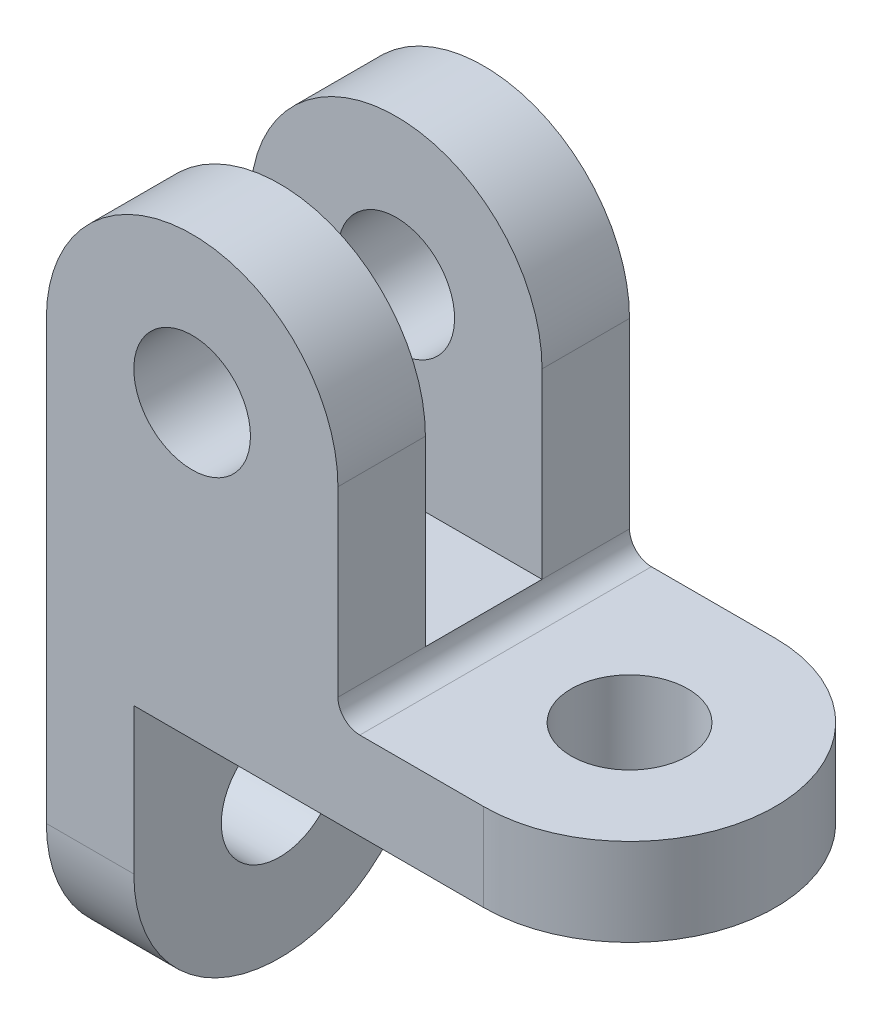
ISO-10303-21;
HEADER;
FILE_DESCRIPTION(('STEP AP214'),'2;1');
FILE_NAME('part.step','',(''),(''),'','','');
FILE_SCHEMA(('AUTOMOTIVE_DESIGN { 1 0 10303 214 1 1 1 1 }'));
ENDSEC;
DATA;
#1=APPLICATION_CONTEXT('core data for automotive mechanical design processes');
#2=APPLICATION_PROTOCOL_DEFINITION('international standard','automotive_design',2000,#1);
#3=PRODUCT_CONTEXT('',#1,'mechanical');
#4=PRODUCT('Part','Part','',(#3));
#5=PRODUCT_RELATED_PRODUCT_CATEGORY('part','',(#4));
#6=PRODUCT_DEFINITION_FORMATION('','',#4);
#7=PRODUCT_DEFINITION_CONTEXT('part definition',#1,'design');
#8=PRODUCT_DEFINITION('design','',#6,#7);
#9=PRODUCT_DEFINITION_SHAPE('','',#8);
#10=(LENGTH_UNIT() NAMED_UNIT(*) SI_UNIT(.MILLI.,.METRE.));
#11=(NAMED_UNIT(*) PLANE_ANGLE_UNIT() SI_UNIT($,.RADIAN.));
#12=(NAMED_UNIT(*) SI_UNIT($,.STERADIAN.) SOLID_ANGLE_UNIT());
#13=UNCERTAINTY_MEASURE_WITH_UNIT(LENGTH_MEASURE(1.E-05),#10,'distance_accuracy_value','');
#14=(GEOMETRIC_REPRESENTATION_CONTEXT(3) GLOBAL_UNCERTAINTY_ASSIGNED_CONTEXT((#13)) GLOBAL_UNIT_ASSIGNED_CONTEXT((#10,
#11,#12)) REPRESENTATION_CONTEXT('',''));
#15=CARTESIAN_POINT('',(0.,0.,0.));
#16=DIRECTION('',(0.,0.,1.));
#17=DIRECTION('',(1.,0.,0.));
#18=AXIS2_PLACEMENT_3D('',#15,#16,#17);
#19=CARTESIAN_POINT('',(-20.,-52.,40.));
#20=DIRECTION('',(1.,0.,0.));
#21=DIRECTION('',(0.,0.,-1.));
#22=AXIS2_PLACEMENT_3D('',#19,#20,#21);
#23=PLANE('',#22);
#24=CARTESIAN_POINT('',(-20.,-32.,20.));
#25=DIRECTION('',(1.,0.,0.));
#26=DIRECTION('',(0.,0.,-1.));
#27=AXIS2_PLACEMENT_3D('',#24,#25,#26);
#28=CIRCLE('',#27,8.);
#29=CARTESIAN_POINT('',(-20.,-24.,20.));
#30=VERTEX_POINT('',#29);
#31=EDGE_CURVE('E247',#30,#30,#28,.T.);
#32=ORIENTED_EDGE('',*,*,#31,.T.);
#33=EDGE_LOOP('',(#32));
#34=FACE_BOUND('',#33,.T.);
#35=DIRECTION('',(0.,-1.,0.));
#36=VECTOR('',#35,1.);
#37=CARTESIAN_POINT('',(-20.,-52.,0.));
#38=LINE('',#37,#36);
#39=CARTESIAN_POINT('',(-20.,28.,0.));
#40=VERTEX_POINT('',#39);
#41=CARTESIAN_POINT('',(-20.,-32.,0.));
#42=VERTEX_POINT('',#41);
#43=EDGE_CURVE('E195',#40,#42,#38,.T.);
#44=ORIENTED_EDGE('',*,*,#43,.T.);
#45=CARTESIAN_POINT('',(-20.,-32.,20.));
#46=DIRECTION('',(1.,0.,0.));
#47=DIRECTION('',(0.,0.,-1.));
#48=AXIS2_PLACEMENT_3D('',#45,#46,#47);
#49=CIRCLE('',#48,20.);
#50=CARTESIAN_POINT('',(-20.,-32.,40.));
#51=VERTEX_POINT('',#50);
#52=EDGE_CURVE('E186',#51,#42,#49,.T.);
#53=ORIENTED_EDGE('',*,*,#52,.F.);
#54=DIRECTION('',(0.,-1.,0.));
#55=VECTOR('',#54,1.);
#56=CARTESIAN_POINT('',(-20.,-52.,40.));
#57=LINE('',#56,#55);
#58=CARTESIAN_POINT('',(-20.,28.,40.));
#59=VERTEX_POINT('',#58);
#60=EDGE_CURVE('E283',#59,#51,#57,.T.);
#61=ORIENTED_EDGE('',*,*,#60,.F.);
#62=DIRECTION('',(0.,0.,-1.));
#63=VECTOR('',#62,1.);
#64=CARTESIAN_POINT('',(-20.,28.,40.));
#65=LINE('',#64,#63);
#66=CARTESIAN_POINT('',(-20.,28.,28.));
#67=VERTEX_POINT('',#66);
#68=EDGE_CURVE('E207',#59,#67,#65,.T.);
#69=ORIENTED_EDGE('',*,*,#68,.T.);
#70=DIRECTION('',(0.,-1.,0.));
#71=VECTOR('',#70,1.);
#72=CARTESIAN_POINT('',(-20.,-52.,28.));
#73=LINE('',#72,#71);
#74=CARTESIAN_POINT('',(-20.,3.,28.));
#75=VERTEX_POINT('',#74);
#76=EDGE_CURVE('E221',#67,#75,#73,.T.);
#77=ORIENTED_EDGE('',*,*,#76,.T.);
#78=DIRECTION('',(0.,0.,-1.));
#79=VECTOR('',#78,1.);
#80=CARTESIAN_POINT('',(-20.,3.,40.));
#81=LINE('',#80,#79);
#82=CARTESIAN_POINT('',(-20.,3.,12.));
#83=VERTEX_POINT('',#82);
#84=EDGE_CURVE('E224',#75,#83,#81,.T.);
#85=ORIENTED_EDGE('',*,*,#84,.T.);
#86=DIRECTION('',(0.,1.,0.));
#87=VECTOR('',#86,1.);
#88=CARTESIAN_POINT('',(-20.,-52.,12.));
#89=LINE('',#88,#87);
#90=CARTESIAN_POINT('',(-20.,28.,12.));
#91=VERTEX_POINT('',#90);
#92=EDGE_CURVE('E83',#83,#91,#89,.T.);
#93=ORIENTED_EDGE('',*,*,#92,.T.);
#94=EDGE_CURVE('E205',#91,#40,#65,.T.);
#95=ORIENTED_EDGE('',*,*,#94,.T.);
#96=EDGE_LOOP('',(#44,#53,#61,#69,#77,#85,#93,#95));
#97=FACE_BOUND('',#96,.T.);
#98=ADVANCED_FACE('F74',(#34,#97),#23,.F.);
#99=CARTESIAN_POINT('',(-8.00000000000001,-12.,40.));
#100=DIRECTION('',(-1.,0.,0.));
#101=DIRECTION('',(0.,-1.,0.));
#102=AXIS2_PLACEMENT_3D('',#99,#100,#101);
#103=PLANE('',#102);
#104=CARTESIAN_POINT('',(-8.,-32.,20.));
#105=DIRECTION('',(1.,0.,0.));
#106=DIRECTION('',(0.,1.,0.));
#107=AXIS2_PLACEMENT_3D('',#104,#105,#106);
#108=CIRCLE('',#107,8.);
#109=CARTESIAN_POINT('',(-8.00000000000001,-24.,20.));
#110=VERTEX_POINT('',#109);
#111=EDGE_CURVE('E244',#110,#110,#108,.T.);
#112=ORIENTED_EDGE('',*,*,#111,.F.);
#113=EDGE_LOOP('',(#112));
#114=FACE_BOUND('',#113,.T.);
#115=CARTESIAN_POINT('',(-8.,-32.,20.));
#116=DIRECTION('',(1.,0.,0.));
#117=DIRECTION('',(0.,1.,0.));
#118=AXIS2_PLACEMENT_3D('',#115,#116,#117);
#119=CIRCLE('',#118,20.);
#120=CARTESIAN_POINT('',(-8.,-32.,40.));
#121=VERTEX_POINT('',#120);
#122=CARTESIAN_POINT('',(-8.,-32.,0.));
#123=VERTEX_POINT('',#122);
#124=EDGE_CURVE('E171',#121,#123,#119,.T.);
#125=ORIENTED_EDGE('',*,*,#124,.T.);
#126=DIRECTION('',(0.,1.,0.));
#127=VECTOR('',#126,1.);
#128=CARTESIAN_POINT('',(-8.00000000000001,-12.,0.));
#129=LINE('',#128,#127);
#130=CARTESIAN_POINT('',(-8.00000000000001,-12.,0.));
#131=VERTEX_POINT('',#130);
#132=EDGE_CURVE('E175',#123,#131,#129,.T.);
#133=ORIENTED_EDGE('',*,*,#132,.T.);
#134=DIRECTION('',(0.,0.,-1.));
#135=VECTOR('',#134,1.);
#136=CARTESIAN_POINT('',(-8.00000000000001,-12.,40.));
#137=LINE('',#136,#135);
#138=CARTESIAN_POINT('',(-8.00000000000001,-12.,40.));
#139=VERTEX_POINT('',#138);
#140=EDGE_CURVE('E203',#139,#131,#137,.T.);
#141=ORIENTED_EDGE('',*,*,#140,.F.);
#142=DIRECTION('',(0.,1.,0.));
#143=VECTOR('',#142,1.);
#144=CARTESIAN_POINT('',(-8.00000000000001,-12.,40.));
#145=LINE('',#144,#143);
#146=EDGE_CURVE('E177',#121,#139,#145,.T.);
#147=ORIENTED_EDGE('',*,*,#146,.F.);
#148=EDGE_LOOP('',(#125,#133,#141,#147));
#149=FACE_BOUND('',#148,.T.);
#150=ADVANCED_FACE('F172',(#114,#149),#103,.F.);
#151=CARTESIAN_POINT('',(0.,28.,0.));
#152=DIRECTION('',(0.,0.,1.));
#153=DIRECTION('',(1.,0.,0.));
#154=AXIS2_PLACEMENT_3D('',#151,#152,#153);
#155=PLANE('',#154);
#156=CARTESIAN_POINT('',(0.,28.,0.));
#157=DIRECTION('',(0.,0.,1.));
#158=DIRECTION('',(1.,0.,0.));
#159=AXIS2_PLACEMENT_3D('',#156,#157,#158);
#160=CIRCLE('',#159,8.);
#161=CARTESIAN_POINT('',(8.,28.,0.));
#162=VERTEX_POINT('',#161);
#163=EDGE_CURVE('E233',#162,#162,#160,.F.);
#164=ORIENTED_EDGE('',*,*,#163,.F.);
#165=EDGE_LOOP('',(#164));
#166=FACE_BOUND('',#165,.T.);
#167=DIRECTION('',(1.,0.,0.));
#168=VECTOR('',#167,1.);
#169=CARTESIAN_POINT('',(-53.,-32.,0.));
#170=LINE('',#169,#168);
#171=EDGE_CURVE('E12',#42,#123,#170,.T.);
#172=ORIENTED_EDGE('',*,*,#171,.F.);
#173=ORIENTED_EDGE('',*,*,#43,.F.);
#174=CARTESIAN_POINT('',(0.,28.,0.));
#175=DIRECTION('',(0.,0.,1.));
#176=DIRECTION('',(1.,0.,0.));
#177=AXIS2_PLACEMENT_3D('',#174,#175,#176);
#178=CIRCLE('',#177,20.);
#179=CARTESIAN_POINT('',(20.,28.,0.));
#180=VERTEX_POINT('',#179);
#181=EDGE_CURVE('E199',#180,#40,#178,.T.);
#182=ORIENTED_EDGE('',*,*,#181,.F.);
#183=DIRECTION('',(0.,1.,0.));
#184=VECTOR('',#183,1.);
#185=CARTESIAN_POINT('',(20.,28.,0.));
#186=LINE('',#185,#184);
#187=CARTESIAN_POINT('',(20.,3.,0.));
#188=VERTEX_POINT('',#187);
#189=EDGE_CURVE('E293',#188,#180,#186,.T.);
#190=ORIENTED_EDGE('',*,*,#189,.F.);
#191=CARTESIAN_POINT('',(23.,3.,0.));
#192=DIRECTION('',(0.,0.,-1.));
#193=DIRECTION('',(-1.,0.,0.));
#194=AXIS2_PLACEMENT_3D('',#191,#192,#193);
#195=CIRCLE('',#194,3.);
#196=CARTESIAN_POINT('',(23.,0.,0.));
#197=VERTEX_POINT('',#196);
#198=EDGE_CURVE('E290',#197,#188,#195,.T.);
#199=ORIENTED_EDGE('',*,*,#198,.F.);
#200=DIRECTION('',(-1.,0.,0.));
#201=VECTOR('',#200,1.);
#202=CARTESIAN_POINT('',(23.,0.,0.));
#203=LINE('',#202,#201);
#204=CARTESIAN_POINT('',(40.,0.,0.));
#205=VERTEX_POINT('',#204);
#206=EDGE_CURVE('E275',#205,#197,#203,.T.);
#207=ORIENTED_EDGE('',*,*,#206,.F.);
#208=DIRECTION('',(0.,1.,0.));
#209=VECTOR('',#208,1.);
#210=CARTESIAN_POINT('',(40.,-12.,0.));
#211=LINE('',#210,#209);
#212=CARTESIAN_POINT('',(40.,-12.,0.));
#213=VERTEX_POINT('',#212);
#214=EDGE_CURVE('E268',#213,#205,#211,.T.);
#215=ORIENTED_EDGE('',*,*,#214,.F.);
#216=DIRECTION('',(1.,0.,0.));
#217=VECTOR('',#216,1.);
#218=CARTESIAN_POINT('',(60.,-12.,0.));
#219=LINE('',#218,#217);
#220=EDGE_CURVE('E194',#131,#213,#219,.T.);
#221=ORIENTED_EDGE('',*,*,#220,.F.);
#222=ORIENTED_EDGE('',*,*,#132,.F.);
#223=EDGE_LOOP('',(#172,#173,#182,#190,#199,#207,#215,#221,#222));
#224=FACE_BOUND('',#223,.T.);
#225=ADVANCED_FACE('F191',(#166,#224),#155,.F.);
#226=CARTESIAN_POINT('',(0.,28.,40.));
#227=DIRECTION('',(0.,0.,1.));
#228=DIRECTION('',(1.,0.,0.));
#229=AXIS2_PLACEMENT_3D('',#226,#227,#228);
#230=PLANE('',#229);
#231=CARTESIAN_POINT('',(0.,28.,40.));
#232=DIRECTION('',(0.,0.,1.));
#233=DIRECTION('',(1.,0.,0.));
#234=AXIS2_PLACEMENT_3D('',#231,#232,#233);
#235=CIRCLE('',#234,8.);
#236=CARTESIAN_POINT('',(8.,28.,40.));
#237=VERTEX_POINT('',#236);
#238=EDGE_CURVE('E238',#237,#237,#235,.F.);
#239=ORIENTED_EDGE('',*,*,#238,.T.);
#240=EDGE_LOOP('',(#239));
#241=FACE_BOUND('',#240,.T.);
#242=ORIENTED_EDGE('',*,*,#60,.T.);
#243=DIRECTION('',(1.,0.,0.));
#244=VECTOR('',#243,1.);
#245=CARTESIAN_POINT('',(-53.,-32.,40.));
#246=LINE('',#245,#244);
#247=EDGE_CURVE('E180',#51,#121,#246,.T.);
#248=ORIENTED_EDGE('',*,*,#247,.T.);
#249=ORIENTED_EDGE('',*,*,#146,.T.);
#250=DIRECTION('',(1.,0.,0.));
#251=VECTOR('',#250,1.);
#252=CARTESIAN_POINT('',(60.,-12.,40.));
#253=LINE('',#252,#251);
#254=CARTESIAN_POINT('',(40.,-12.,40.));
#255=VERTEX_POINT('',#254);
#256=EDGE_CURVE('E206',#139,#255,#253,.T.);
#257=ORIENTED_EDGE('',*,*,#256,.T.);
#258=DIRECTION('',(0.,1.,0.));
#259=VECTOR('',#258,1.);
#260=CARTESIAN_POINT('',(40.,-12.,40.));
#261=LINE('',#260,#259);
#262=CARTESIAN_POINT('',(40.,0.,40.));
#263=VERTEX_POINT('',#262);
#264=EDGE_CURVE('E272',#255,#263,#261,.T.);
#265=ORIENTED_EDGE('',*,*,#264,.T.);
#266=DIRECTION('',(-1.,0.,0.));
#267=VECTOR('',#266,1.);
#268=CARTESIAN_POINT('',(23.,0.,40.));
#269=LINE('',#268,#267);
#270=CARTESIAN_POINT('',(23.,0.,40.));
#271=VERTEX_POINT('',#270);
#272=EDGE_CURVE('E197',#263,#271,#269,.T.);
#273=ORIENTED_EDGE('',*,*,#272,.T.);
#274=CARTESIAN_POINT('',(23.,3.,40.));
#275=DIRECTION('',(0.,0.,-1.));
#276=DIRECTION('',(-1.,0.,0.));
#277=AXIS2_PLACEMENT_3D('',#274,#275,#276);
#278=CIRCLE('',#277,3.);
#279=CARTESIAN_POINT('',(20.,3.,40.));
#280=VERTEX_POINT('',#279);
#281=EDGE_CURVE('E277',#271,#280,#278,.T.);
#282=ORIENTED_EDGE('',*,*,#281,.T.);
#283=DIRECTION('',(0.,1.,0.));
#284=VECTOR('',#283,1.);
#285=CARTESIAN_POINT('',(20.,28.,40.));
#286=LINE('',#285,#284);
#287=CARTESIAN_POINT('',(20.,28.,40.));
#288=VERTEX_POINT('',#287);
#289=EDGE_CURVE('E279',#280,#288,#286,.T.);
#290=ORIENTED_EDGE('',*,*,#289,.T.);
#291=CARTESIAN_POINT('',(0.,28.,40.));
#292=DIRECTION('',(0.,0.,1.));
#293=DIRECTION('',(1.,0.,0.));
#294=AXIS2_PLACEMENT_3D('',#291,#292,#293);
#295=CIRCLE('',#294,20.);
#296=EDGE_CURVE('E281',#288,#59,#295,.T.);
#297=ORIENTED_EDGE('',*,*,#296,.T.);
#298=EDGE_LOOP('',(#242,#248,#249,#257,#265,#273,#282,#290,#297));
#299=FACE_BOUND('',#298,.T.);
#300=ADVANCED_FACE('F320',(#241,#299),#230,.T.);
#301=CARTESIAN_POINT('',(20.,28.,40.));
#302=DIRECTION('',(-1.,0.,0.));
#303=DIRECTION('',(0.,-1.,0.));
#304=AXIS2_PLACEMENT_3D('',#301,#302,#303);
#305=PLANE('',#304);
#306=DIRECTION('',(0.,0.,-1.));
#307=VECTOR('',#306,1.);
#308=CARTESIAN_POINT('',(20.,28.,40.));
#309=LINE('',#308,#307);
#310=CARTESIAN_POINT('',(20.,28.,12.));
#311=VERTEX_POINT('',#310);
#312=EDGE_CURVE('E210',#311,#180,#309,.T.);
#313=ORIENTED_EDGE('',*,*,#312,.F.);
#314=DIRECTION('',(0.,-1.,0.));
#315=VECTOR('',#314,1.);
#316=CARTESIAN_POINT('',(20.,28.,12.));
#317=LINE('',#316,#315);
#318=CARTESIAN_POINT('',(20.,3.,12.));
#319=VERTEX_POINT('',#318);
#320=EDGE_CURVE('E265',#311,#319,#317,.T.);
#321=ORIENTED_EDGE('',*,*,#320,.T.);
#322=DIRECTION('',(0.,0.,-1.));
#323=VECTOR('',#322,1.);
#324=CARTESIAN_POINT('',(20.,3.,40.));
#325=LINE('',#324,#323);
#326=EDGE_CURVE('E214',#319,#188,#325,.T.);
#327=ORIENTED_EDGE('',*,*,#326,.T.);
#328=ORIENTED_EDGE('',*,*,#189,.T.);
#329=EDGE_LOOP('',(#313,#321,#327,#328));
#330=FACE_BOUND('',#329,.T.);
#331=ADVANCED_FACE('F328',(#330),#305,.F.);
#332=CARTESIAN_POINT('',(0.,28.,40.));
#333=DIRECTION('',(0.,0.,-1.));
#334=DIRECTION('',(-1.,0.,0.));
#335=AXIS2_PLACEMENT_3D('',#332,#333,#334);
#336=CYLINDRICAL_SURFACE('',#335,20.);
#337=CARTESIAN_POINT('',(0.,28.,28.));
#338=DIRECTION('',(0.,0.,1.));
#339=DIRECTION('',(0.,-1.,0.));
#340=AXIS2_PLACEMENT_3D('',#337,#338,#339);
#341=CIRCLE('',#340,20.);
#342=CARTESIAN_POINT('',(20.,28.,28.));
#343=VERTEX_POINT('',#342);
#344=EDGE_CURVE('E253',#343,#67,#341,.T.);
#345=ORIENTED_EDGE('',*,*,#344,.T.);
#346=ORIENTED_EDGE('',*,*,#68,.F.);
#347=ORIENTED_EDGE('',*,*,#296,.F.);
#348=EDGE_CURVE('E211',#288,#343,#309,.T.);
#349=ORIENTED_EDGE('',*,*,#348,.T.);
#350=EDGE_LOOP('',(#345,#346,#347,#349));
#351=FACE_BOUND('',#350,.T.);
#352=ADVANCED_FACE('F330',(#351),#336,.T.);
#353=CARTESIAN_POINT('',(23.,0.,40.));
#354=DIRECTION('',(0.,-1.,0.));
#355=DIRECTION('',(0.,0.,-1.));
#356=AXIS2_PLACEMENT_3D('',#353,#354,#355);
#357=PLANE('',#356);
#358=CARTESIAN_POINT('',(40.,0.,20.));
#359=DIRECTION('',(0.,1.,0.));
#360=DIRECTION('',(0.,0.,1.));
#361=AXIS2_PLACEMENT_3D('',#358,#359,#360);
#362=CIRCLE('',#361,8.);
#363=CARTESIAN_POINT('',(40.,0.,28.));
#364=VERTEX_POINT('',#363);
#365=EDGE_CURVE('E229',#364,#364,#362,.T.);
#366=ORIENTED_EDGE('',*,*,#365,.F.);
#367=EDGE_LOOP('',(#366));
#368=FACE_BOUND('',#367,.T.);
#369=CARTESIAN_POINT('',(40.,0.,20.));
#370=DIRECTION('',(0.,1.,0.));
#371=DIRECTION('',(0.,0.,1.));
#372=AXIS2_PLACEMENT_3D('',#369,#370,#371);
#373=CIRCLE('',#372,20.);
#374=EDGE_CURVE('E99',#263,#205,#373,.T.);
#375=ORIENTED_EDGE('',*,*,#374,.T.);
#376=ORIENTED_EDGE('',*,*,#206,.T.);
#377=DIRECTION('',(0.,0.,-1.));
#378=VECTOR('',#377,1.);
#379=CARTESIAN_POINT('',(23.,0.,40.));
#380=LINE('',#379,#378);
#381=EDGE_CURVE('E218',#271,#197,#380,.T.);
#382=ORIENTED_EDGE('',*,*,#381,.F.);
#383=ORIENTED_EDGE('',*,*,#272,.F.);
#384=EDGE_LOOP('',(#375,#376,#382,#383));
#385=FACE_BOUND('',#384,.T.);
#386=ADVANCED_FACE('F76',(#368,#385),#357,.F.);
#387=CARTESIAN_POINT('',(60.,-12.,40.));
#388=DIRECTION('',(0.,1.,0.));
#389=DIRECTION('',(-1.,0.,0.));
#390=AXIS2_PLACEMENT_3D('',#387,#388,#389);
#391=PLANE('',#390);
#392=CARTESIAN_POINT('',(40.,-12.,20.));
#393=DIRECTION('',(0.,1.,0.));
#394=DIRECTION('',(-1.,0.,0.));
#395=AXIS2_PLACEMENT_3D('',#392,#393,#394);
#396=CIRCLE('',#395,8.);
#397=CARTESIAN_POINT('',(40.,-12.,28.));
#398=VERTEX_POINT('',#397);
#399=EDGE_CURVE('E181',#398,#398,#396,.T.);
#400=ORIENTED_EDGE('',*,*,#399,.T.);
#401=EDGE_LOOP('',(#400));
#402=FACE_BOUND('',#401,.T.);
#403=ORIENTED_EDGE('',*,*,#220,.T.);
#404=CARTESIAN_POINT('',(40.,-12.,20.));
#405=DIRECTION('',(0.,1.,0.));
#406=DIRECTION('',(0.,0.,1.));
#407=AXIS2_PLACEMENT_3D('',#404,#405,#406);
#408=CIRCLE('',#407,20.);
#409=EDGE_CURVE('E270',#255,#213,#408,.T.);
#410=ORIENTED_EDGE('',*,*,#409,.F.);
#411=ORIENTED_EDGE('',*,*,#256,.F.);
#412=ORIENTED_EDGE('',*,*,#140,.T.);
#413=EDGE_LOOP('',(#403,#410,#411,#412));
#414=FACE_BOUND('',#413,.T.);
#415=ADVANCED_FACE('F367',(#402,#414),#391,.F.);
#416=CARTESIAN_POINT('',(23.,3.,40.));
#417=DIRECTION('',(0.,0.,-1.));
#418=DIRECTION('',(-1.,0.,0.));
#419=AXIS2_PLACEMENT_3D('',#416,#417,#418);
#420=CYLINDRICAL_SURFACE('',#419,3.);
#421=ORIENTED_EDGE('',*,*,#198,.T.);
#422=ORIENTED_EDGE('',*,*,#326,.F.);
#423=DIRECTION('',(0.,0.,1.));
#424=VECTOR('',#423,1.);
#425=CARTESIAN_POINT('',(20.,3.,40.));
#426=LINE('',#425,#424);
#427=CARTESIAN_POINT('',(20.,3.,28.));
#428=VERTEX_POINT('',#427);
#429=EDGE_CURVE('E259',#319,#428,#426,.T.);
#430=ORIENTED_EDGE('',*,*,#429,.T.);
#431=EDGE_CURVE('E215',#280,#428,#325,.T.);
#432=ORIENTED_EDGE('',*,*,#431,.F.);
#433=ORIENTED_EDGE('',*,*,#281,.F.);
#434=ORIENTED_EDGE('',*,*,#381,.T.);
#435=EDGE_LOOP('',(#421,#422,#430,#432,#433,#434));
#436=FACE_BOUND('',#435,.T.);
#437=ADVANCED_FACE('F312',(#436),#420,.F.);
#438=ORIENTED_EDGE('',*,*,#431,.T.);
#439=DIRECTION('',(0.,1.,0.));
#440=VECTOR('',#439,1.);
#441=CARTESIAN_POINT('',(20.,28.,28.));
#442=LINE('',#441,#440);
#443=EDGE_CURVE('E256',#428,#343,#442,.T.);
#444=ORIENTED_EDGE('',*,*,#443,.T.);
#445=ORIENTED_EDGE('',*,*,#348,.F.);
#446=ORIENTED_EDGE('',*,*,#289,.F.);
#447=EDGE_LOOP('',(#438,#444,#445,#446));
#448=FACE_BOUND('',#447,.T.);
#449=ADVANCED_FACE('F316',(#448),#305,.F.);
#450=ORIENTED_EDGE('',*,*,#94,.F.);
#451=CARTESIAN_POINT('',(0.,28.,12.));
#452=DIRECTION('',(0.,0.,-1.));
#453=DIRECTION('',(0.,1.,0.));
#454=AXIS2_PLACEMENT_3D('',#451,#452,#453);
#455=CIRCLE('',#454,20.);
#456=EDGE_CURVE('E262',#91,#311,#455,.T.);
#457=ORIENTED_EDGE('',*,*,#456,.T.);
#458=ORIENTED_EDGE('',*,*,#312,.T.);
#459=ORIENTED_EDGE('',*,*,#181,.T.);
#460=EDGE_LOOP('',(#450,#457,#458,#459));
#461=FACE_BOUND('',#460,.T.);
#462=ADVANCED_FACE('F299',(#461),#336,.T.);
#463=CARTESIAN_POINT('',(40.,-12.,20.));
#464=DIRECTION('',(0.,1.,0.));
#465=DIRECTION('',(0.,0.,1.));
#466=AXIS2_PLACEMENT_3D('',#463,#464,#465);
#467=CYLINDRICAL_SURFACE('',#466,20.);
#468=ORIENTED_EDGE('',*,*,#374,.F.);
#469=ORIENTED_EDGE('',*,*,#264,.F.);
#470=ORIENTED_EDGE('',*,*,#409,.T.);
#471=ORIENTED_EDGE('',*,*,#214,.T.);
#472=EDGE_LOOP('',(#468,#469,#470,#471));
#473=FACE_BOUND('',#472,.T.);
#474=ADVANCED_FACE('F351',(#473),#467,.T.);
#475=CARTESIAN_POINT('',(-22.5,3.,12.));
#476=DIRECTION('',(0.,0.,-1.));
#477=DIRECTION('',(0.,1.,0.));
#478=AXIS2_PLACEMENT_3D('',#475,#476,#477);
#479=PLANE('',#478);
#480=CARTESIAN_POINT('',(0.,28.,12.));
#481=DIRECTION('',(0.,0.,-1.));
#482=DIRECTION('',(0.,1.,0.));
#483=AXIS2_PLACEMENT_3D('',#480,#481,#482);
#484=CIRCLE('',#483,8.);
#485=CARTESIAN_POINT('',(0.,36.,12.));
#486=VERTEX_POINT('',#485);
#487=EDGE_CURVE('E389',#486,#486,#484,.F.);
#488=ORIENTED_EDGE('',*,*,#487,.F.);
#489=EDGE_LOOP('',(#488));
#490=FACE_BOUND('',#489,.T.);
#491=ORIENTED_EDGE('',*,*,#456,.F.);
#492=ORIENTED_EDGE('',*,*,#92,.F.);
#493=DIRECTION('',(1.,0.,0.));
#494=VECTOR('',#493,1.);
#495=CARTESIAN_POINT('',(-22.5,3.,12.));
#496=LINE('',#495,#494);
#497=EDGE_CURVE('E250',#83,#319,#496,.T.);
#498=ORIENTED_EDGE('',*,*,#497,.T.);
#499=ORIENTED_EDGE('',*,*,#320,.F.);
#500=EDGE_LOOP('',(#491,#492,#498,#499));
#501=FACE_BOUND('',#500,.T.);
#502=ADVANCED_FACE('F306',(#490,#501),#479,.F.);
#503=CARTESIAN_POINT('',(-22.5,3.,28.));
#504=DIRECTION('',(0.,-1.,0.));
#505=DIRECTION('',(0.,0.,-1.));
#506=AXIS2_PLACEMENT_3D('',#503,#504,#505);
#507=PLANE('',#506);
#508=ORIENTED_EDGE('',*,*,#497,.F.);
#509=ORIENTED_EDGE('',*,*,#84,.F.);
#510=DIRECTION('',(1.,0.,0.));
#511=VECTOR('',#510,1.);
#512=CARTESIAN_POINT('',(-22.5,3.,28.));
#513=LINE('',#512,#511);
#514=EDGE_CURVE('E91',#75,#428,#513,.T.);
#515=ORIENTED_EDGE('',*,*,#514,.T.);
#516=ORIENTED_EDGE('',*,*,#429,.F.);
#517=EDGE_LOOP('',(#508,#509,#515,#516));
#518=FACE_BOUND('',#517,.T.);
#519=ADVANCED_FACE('F308',(#518),#507,.F.);
#520=CARTESIAN_POINT('',(-22.5,48.,28.));
#521=DIRECTION('',(0.,0.,1.));
#522=DIRECTION('',(0.,-1.,0.));
#523=AXIS2_PLACEMENT_3D('',#520,#521,#522);
#524=PLANE('',#523);
#525=CARTESIAN_POINT('',(0.,28.,28.));
#526=DIRECTION('',(0.,0.,1.));
#527=DIRECTION('',(0.,-1.,0.));
#528=AXIS2_PLACEMENT_3D('',#525,#526,#527);
#529=CIRCLE('',#528,8.);
#530=CARTESIAN_POINT('',(0.,20.,28.));
#531=VERTEX_POINT('',#530);
#532=EDGE_CURVE('E78',#531,#531,#529,.F.);
#533=ORIENTED_EDGE('',*,*,#532,.F.);
#534=EDGE_LOOP('',(#533));
#535=FACE_BOUND('',#534,.T.);
#536=ORIENTED_EDGE('',*,*,#514,.F.);
#537=ORIENTED_EDGE('',*,*,#76,.F.);
#538=ORIENTED_EDGE('',*,*,#344,.F.);
#539=ORIENTED_EDGE('',*,*,#443,.F.);
#540=EDGE_LOOP('',(#536,#537,#538,#539));
#541=FACE_BOUND('',#540,.T.);
#542=ADVANCED_FACE('F362',(#535,#541),#524,.F.);
#543=CARTESIAN_POINT('',(-53.,-32.,20.));
#544=DIRECTION('',(1.,0.,0.));
#545=DIRECTION('',(0.,1.,0.));
#546=AXIS2_PLACEMENT_3D('',#543,#544,#545);
#547=CYLINDRICAL_SURFACE('',#546,8.);
#548=CARTESIAN_POINT('',(-8.00000000000001,-24.,20.));
#549=CARTESIAN_POINT('',(-8.12500000000001,-24.,20.));
#550=CARTESIAN_POINT('',(-8.25000000000001,-24.,20.));
#551=CARTESIAN_POINT('',(-8.50000000000001,-24.,20.));
#552=CARTESIAN_POINT('',(-8.62500000000001,-24.,20.));
#553=CARTESIAN_POINT('',(-8.87500000000001,-24.,20.));
#554=CARTESIAN_POINT('',(-9.00000000000001,-24.,20.));
#555=CARTESIAN_POINT('',(-9.25000000000001,-24.,20.));
#556=CARTESIAN_POINT('',(-9.37500000000001,-24.,20.));
#557=CARTESIAN_POINT('',(-9.62500000000001,-24.,20.));
#558=CARTESIAN_POINT('',(-9.75000000000001,-24.,20.));
#559=CARTESIAN_POINT('',(-10.,-24.,20.));
#560=CARTESIAN_POINT('',(-10.125,-24.,20.));
#561=CARTESIAN_POINT('',(-10.375,-24.,20.));
#562=CARTESIAN_POINT('',(-10.5,-24.,20.));
#563=CARTESIAN_POINT('',(-10.75,-24.,20.));
#564=CARTESIAN_POINT('',(-10.875,-24.,20.));
#565=CARTESIAN_POINT('',(-11.125,-24.,20.));
#566=CARTESIAN_POINT('',(-11.25,-24.,20.));
#567=CARTESIAN_POINT('',(-11.5,-24.,20.));
#568=CARTESIAN_POINT('',(-11.625,-24.,20.));
#569=CARTESIAN_POINT('',(-11.875,-24.,20.));
#570=CARTESIAN_POINT('',(-12.,-24.,20.));
#571=CARTESIAN_POINT('',(-12.25,-24.,20.));
#572=CARTESIAN_POINT('',(-12.375,-24.,20.));
#573=CARTESIAN_POINT('',(-12.625,-24.,20.));
#574=CARTESIAN_POINT('',(-12.75,-24.,20.));
#575=CARTESIAN_POINT('',(-13.,-24.,20.));
#576=CARTESIAN_POINT('',(-13.125,-24.,20.));
#577=CARTESIAN_POINT('',(-13.375,-24.,20.));
#578=CARTESIAN_POINT('',(-13.5,-24.,20.));
#579=CARTESIAN_POINT('',(-13.75,-24.,20.));
#580=CARTESIAN_POINT('',(-13.875,-24.,20.));
#581=CARTESIAN_POINT('',(-14.125,-24.,20.));
#582=CARTESIAN_POINT('',(-14.25,-24.,20.));
#583=CARTESIAN_POINT('',(-14.5,-24.,20.));
#584=CARTESIAN_POINT('',(-14.625,-24.,20.));
#585=CARTESIAN_POINT('',(-14.875,-24.,20.));
#586=CARTESIAN_POINT('',(-15.,-24.,20.));
#587=CARTESIAN_POINT('',(-15.25,-24.,20.));
#588=CARTESIAN_POINT('',(-15.375,-24.,20.));
#589=CARTESIAN_POINT('',(-15.625,-24.,20.));
#590=CARTESIAN_POINT('',(-15.75,-24.,20.));
#591=CARTESIAN_POINT('',(-16.,-24.,20.));
#592=CARTESIAN_POINT('',(-16.125,-24.,20.));
#593=CARTESIAN_POINT('',(-16.375,-24.,20.));
#594=CARTESIAN_POINT('',(-16.5,-24.,20.));
#595=CARTESIAN_POINT('',(-16.75,-24.,20.));
#596=CARTESIAN_POINT('',(-16.875,-24.,20.));
#597=CARTESIAN_POINT('',(-17.125,-24.,20.));
#598=CARTESIAN_POINT('',(-17.25,-24.,20.));
#599=CARTESIAN_POINT('',(-17.5,-24.,20.));
#600=CARTESIAN_POINT('',(-17.625,-24.,20.));
#601=CARTESIAN_POINT('',(-17.875,-24.,20.));
#602=CARTESIAN_POINT('',(-18.,-24.,20.));
#603=CARTESIAN_POINT('',(-18.25,-24.,20.));
#604=CARTESIAN_POINT('',(-18.375,-24.,20.));
#605=CARTESIAN_POINT('',(-18.625,-24.,20.));
#606=CARTESIAN_POINT('',(-18.75,-24.,20.));
#607=CARTESIAN_POINT('',(-19.,-24.,20.));
#608=CARTESIAN_POINT('',(-19.125,-24.,20.));
#609=CARTESIAN_POINT('',(-19.375,-24.,20.));
#610=CARTESIAN_POINT('',(-19.5,-24.,20.));
#611=CARTESIAN_POINT('',(-19.75,-24.,20.));
#612=CARTESIAN_POINT('',(-19.875,-24.,20.));
#613=CARTESIAN_POINT('',(-20.,-24.,20.));
#614=B_SPLINE_CURVE_WITH_KNOTS('',3,(#548,#549,#550,#551,#552,#553,#554,#555,#556,#557,#558,
#559,#560,#561,#562,#563,#564,#565,#566,#567,#568,#569,#570,#571,#572,#573,#574,#575,#576,#577,
#578,#579,#580,#581,#582,#583,#584,#585,#586,#587,#588,#589,#590,#591,#592,#593,#594,#595,#596,
#597,#598,#599,#600,#601,#602,#603,#604,#605,#606,#607,#608,#609,#610,#611,#612,#613),
.UNSPECIFIED.,.F.,.F.,(4,2,2,2,2,2,2,2,2,2,2,2,2,2,2,2,2,2,2,2,2,2,2,2,2,2,2,2,2,2,2,2,4),(0.,
0.375,0.750000000000001,1.125,1.5,1.875,2.25,2.625,3.,3.375,3.75,4.125,4.5,4.875,5.25,5.625,6.,
6.375,6.75,7.125,7.5,7.875,8.24999999999999,8.62499999999999,8.99999999999999,9.37499999999999,
9.74999999999999,10.125,10.5,10.875,11.25,11.625,12.),.UNSPECIFIED.);
#615=EDGE_CURVE('BSEAM378',#110,#30,#614,.T.);
#616=ORIENTED_EDGE('',*,*,#111,.T.);
#617=ORIENTED_EDGE('',*,*,#31,.F.);
#618=ORIENTED_EDGE('',*,*,#615,.T.);
#619=ORIENTED_EDGE('',*,*,#615,.F.);
#620=EDGE_LOOP('',(#616,#618,#617,#619));
#621=FACE_BOUND('',#620,.T.);
#622=ADVANCED_FACE('F378',(#621),#547,.F.);
#623=CARTESIAN_POINT('',(-53.,-32.,20.));
#624=DIRECTION('',(1.,0.,0.));
#625=DIRECTION('',(0.,1.,0.));
#626=AXIS2_PLACEMENT_3D('',#623,#624,#625);
#627=CYLINDRICAL_SURFACE('',#626,20.);
#628=ORIENTED_EDGE('',*,*,#52,.T.);
#629=ORIENTED_EDGE('',*,*,#171,.T.);
#630=ORIENTED_EDGE('',*,*,#124,.F.);
#631=ORIENTED_EDGE('',*,*,#247,.F.);
#632=EDGE_LOOP('',(#628,#629,#630,#631));
#633=FACE_BOUND('',#632,.T.);
#634=ADVANCED_FACE('F184',(#633),#627,.T.);
#635=CARTESIAN_POINT('',(40.,-45.,20.));
#636=DIRECTION('',(0.,1.,0.));
#637=DIRECTION('',(0.,0.,1.));
#638=AXIS2_PLACEMENT_3D('',#635,#636,#637);
#639=CYLINDRICAL_SURFACE('',#638,8.);
#640=CARTESIAN_POINT('',(40.,0.,28.));
#641=CARTESIAN_POINT('',(40.,-0.125000000000007,28.));
#642=CARTESIAN_POINT('',(40.,-0.250000000000007,28.));
#643=CARTESIAN_POINT('',(40.,-0.500000000000007,28.));
#644=CARTESIAN_POINT('',(40.,-0.625000000000008,28.));
#645=CARTESIAN_POINT('',(40.,-0.875000000000008,28.));
#646=CARTESIAN_POINT('',(40.,-1.00000000000001,28.));
#647=CARTESIAN_POINT('',(40.,-1.25000000000001,28.));
#648=CARTESIAN_POINT('',(40.,-1.37500000000001,28.));
#649=CARTESIAN_POINT('',(40.,-1.62500000000001,28.));
#650=CARTESIAN_POINT('',(40.,-1.75000000000001,28.));
#651=CARTESIAN_POINT('',(40.,-2.00000000000001,28.));
#652=CARTESIAN_POINT('',(40.,-2.12500000000001,28.));
#653=CARTESIAN_POINT('',(40.,-2.37500000000001,28.));
#654=CARTESIAN_POINT('',(40.,-2.50000000000001,28.));
#655=CARTESIAN_POINT('',(40.,-2.75000000000001,28.));
#656=CARTESIAN_POINT('',(40.,-2.87500000000001,28.));
#657=CARTESIAN_POINT('',(40.,-3.12500000000001,28.));
#658=CARTESIAN_POINT('',(40.,-3.25,28.));
#659=CARTESIAN_POINT('',(40.,-3.5,28.));
#660=CARTESIAN_POINT('',(40.,-3.625,28.));
#661=CARTESIAN_POINT('',(40.,-3.875,28.));
#662=CARTESIAN_POINT('',(40.,-4.,28.));
#663=CARTESIAN_POINT('',(40.,-4.25,28.));
#664=CARTESIAN_POINT('',(40.,-4.375,28.));
#665=CARTESIAN_POINT('',(40.,-4.625,28.));
#666=CARTESIAN_POINT('',(40.,-4.75,28.));
#667=CARTESIAN_POINT('',(40.,-5.,28.));
#668=CARTESIAN_POINT('',(40.,-5.125,28.));
#669=CARTESIAN_POINT('',(40.,-5.375,28.));
#670=CARTESIAN_POINT('',(40.,-5.50000000000001,28.));
#671=CARTESIAN_POINT('',(40.,-5.75000000000001,28.));
#672=CARTESIAN_POINT('',(40.,-5.87500000000001,28.));
#673=CARTESIAN_POINT('',(40.,-6.12500000000001,28.));
#674=CARTESIAN_POINT('',(40.,-6.25000000000001,28.));
#675=CARTESIAN_POINT('',(40.,-6.50000000000001,28.));
#676=CARTESIAN_POINT('',(40.,-6.62500000000001,28.));
#677=CARTESIAN_POINT('',(40.,-6.87500000000001,28.));
#678=CARTESIAN_POINT('',(40.,-7.00000000000001,28.));
#679=CARTESIAN_POINT('',(40.,-7.25000000000001,28.));
#680=CARTESIAN_POINT('',(40.,-7.37500000000001,28.));
#681=CARTESIAN_POINT('',(40.,-7.62500000000001,28.));
#682=CARTESIAN_POINT('',(40.,-7.75000000000001,28.));
#683=CARTESIAN_POINT('',(40.,-8.00000000000001,28.));
#684=CARTESIAN_POINT('',(40.,-8.125,28.));
#685=CARTESIAN_POINT('',(40.,-8.375,28.));
#686=CARTESIAN_POINT('',(40.,-8.5,28.));
#687=CARTESIAN_POINT('',(40.,-8.75,28.));
#688=CARTESIAN_POINT('',(40.,-8.875,28.));
#689=CARTESIAN_POINT('',(40.,-9.125,28.));
#690=CARTESIAN_POINT('',(40.,-9.25,28.));
#691=CARTESIAN_POINT('',(40.,-9.5,28.));
#692=CARTESIAN_POINT('',(40.,-9.625,28.));
#693=CARTESIAN_POINT('',(40.,-9.875,28.));
#694=CARTESIAN_POINT('',(40.,-10.,28.));
#695=CARTESIAN_POINT('',(40.,-10.25,28.));
#696=CARTESIAN_POINT('',(40.,-10.375,28.));
#697=CARTESIAN_POINT('',(40.,-10.625,28.));
#698=CARTESIAN_POINT('',(40.,-10.75,28.));
#699=CARTESIAN_POINT('',(40.,-11.,28.));
#700=CARTESIAN_POINT('',(40.,-11.125,28.));
#701=CARTESIAN_POINT('',(40.,-11.375,28.));
#702=CARTESIAN_POINT('',(40.,-11.5,28.));
#703=CARTESIAN_POINT('',(40.,-11.75,28.));
#704=CARTESIAN_POINT('',(40.,-11.875,28.));
#705=CARTESIAN_POINT('',(40.,-12.,28.));
#706=B_SPLINE_CURVE_WITH_KNOTS('',3,(#640,#641,#642,#643,#644,#645,#646,#647,#648,#649,#650,
#651,#652,#653,#654,#655,#656,#657,#658,#659,#660,#661,#662,#663,#664,#665,#666,#667,#668,#669,
#670,#671,#672,#673,#674,#675,#676,#677,#678,#679,#680,#681,#682,#683,#684,#685,#686,#687,#688,
#689,#690,#691,#692,#693,#694,#695,#696,#697,#698,#699,#700,#701,#702,#703,#704,#705),
.UNSPECIFIED.,.F.,.F.,(4,2,2,2,2,2,2,2,2,2,2,2,2,2,2,2,2,2,2,2,2,2,2,2,2,2,2,2,2,2,2,2,4),(0.,
0.375,0.750000000000001,1.125,1.5,1.875,2.25,2.625,3.,3.375,3.75,4.125,4.5,4.875,5.25,5.625,6.,
6.375,6.75,7.125,7.5,7.875,8.24999999999999,8.62499999999999,8.99999999999999,9.37499999999999,
9.74999999999999,10.125,10.5,10.875,11.25,11.625,12.),.UNSPECIFIED.);
#707=EDGE_CURVE('BSEAM400',#364,#398,#706,.T.);
#708=ORIENTED_EDGE('',*,*,#365,.T.);
#709=ORIENTED_EDGE('',*,*,#399,.F.);
#710=ORIENTED_EDGE('',*,*,#707,.T.);
#711=ORIENTED_EDGE('',*,*,#707,.F.);
#712=EDGE_LOOP('',(#708,#710,#709,#711));
#713=FACE_BOUND('',#712,.T.);
#714=ADVANCED_FACE('F400',(#713),#639,.F.);
#715=CARTESIAN_POINT('',(0.,28.,54.));
#716=DIRECTION('',(0.,0.,-1.));
#717=DIRECTION('',(-1.,0.,0.));
#718=AXIS2_PLACEMENT_3D('',#715,#716,#717);
#719=CYLINDRICAL_SURFACE('',#718,8.);
#720=ORIENTED_EDGE('',*,*,#238,.F.);
#721=EDGE_LOOP('',(#720));
#722=FACE_BOUND('',#721,.T.);
#723=ORIENTED_EDGE('',*,*,#532,.T.);
#724=EDGE_LOOP('',(#723));
#725=FACE_BOUND('',#724,.T.);
#726=ADVANCED_FACE('F397',(#722,#725),#719,.F.);
#727=ORIENTED_EDGE('',*,*,#487,.T.);
#728=EDGE_LOOP('',(#727));
#729=FACE_BOUND('',#728,.T.);
#730=ORIENTED_EDGE('',*,*,#163,.T.);
#731=EDGE_LOOP('',(#730));
#732=FACE_BOUND('',#731,.T.);
#733=ADVANCED_FACE('F399',(#729,#732),#719,.F.);
#734=CLOSED_SHELL('',(#98,#150,#225,#300,#331,#352,#386,#415,#437,#449,#462,#474,#502,#519,#542,
#622,#634,#714,#726,#733));
#735=MANIFOLD_SOLID_BREP('B2',#734);
#736=ADVANCED_BREP_SHAPE_REPRESENTATION('',(#18,#735),#14);
#737=SHAPE_DEFINITION_REPRESENTATION(#9,#736);
ENDSEC;
END-ISO-10303-21;
